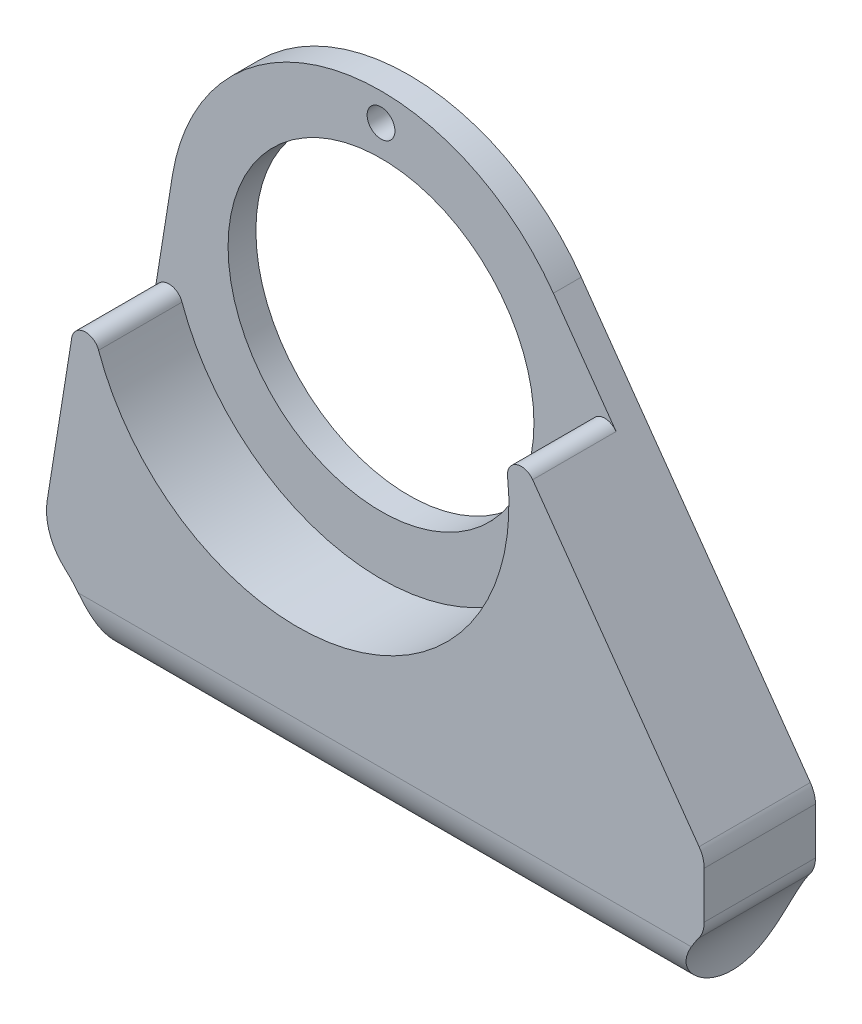
ISO-10303-21;
HEADER;
FILE_DESCRIPTION(('STEP AP214'),'2;1');
FILE_NAME('part.step','',(''),(''),'','','');
FILE_SCHEMA(('AUTOMOTIVE_DESIGN { 1 0 10303 214 1 1 1 1 }'));
ENDSEC;
DATA;
#1=APPLICATION_CONTEXT('core data for automotive mechanical design processes');
#2=APPLICATION_PROTOCOL_DEFINITION('international standard','automotive_design',2000,#1);
#3=PRODUCT_CONTEXT('',#1,'mechanical');
#4=PRODUCT('Part','Part','',(#3));
#5=PRODUCT_RELATED_PRODUCT_CATEGORY('part','',(#4));
#6=PRODUCT_DEFINITION_FORMATION('','',#4);
#7=PRODUCT_DEFINITION_CONTEXT('part definition',#1,'design');
#8=PRODUCT_DEFINITION('design','',#6,#7);
#9=PRODUCT_DEFINITION_SHAPE('','',#8);
#10=(LENGTH_UNIT() NAMED_UNIT(*) SI_UNIT(.MILLI.,.METRE.));
#11=(NAMED_UNIT(*) PLANE_ANGLE_UNIT() SI_UNIT($,.RADIAN.));
#12=(NAMED_UNIT(*) SI_UNIT($,.STERADIAN.) SOLID_ANGLE_UNIT());
#13=UNCERTAINTY_MEASURE_WITH_UNIT(LENGTH_MEASURE(1.E-05),#10,'distance_accuracy_value','');
#14=(GEOMETRIC_REPRESENTATION_CONTEXT(3) GLOBAL_UNCERTAINTY_ASSIGNED_CONTEXT((#13)) GLOBAL_UNIT_ASSIGNED_CONTEXT((#10,
#11,#12)) REPRESENTATION_CONTEXT('',''));
#15=CARTESIAN_POINT('',(0.,0.,0.));
#16=DIRECTION('',(0.,0.,1.));
#17=DIRECTION('',(1.,0.,0.));
#18=AXIS2_PLACEMENT_3D('',#15,#16,#17);
#19=CARTESIAN_POINT('',(0.,0.,5.));
#20=DIRECTION('',(0.,0.,-1.));
#21=DIRECTION('',(-1.,0.,0.));
#22=AXIS2_PLACEMENT_3D('',#19,#20,#21);
#23=CYLINDRICAL_SURFACE('',#22,38.);
#24=DIRECTION('',(0.,0.,-1.));
#25=VECTOR('',#24,1.);
#26=CARTESIAN_POINT('',(-37.5209884030344,6.01460133835652,5.));
#27=LINE('',#26,#25);
#28=CARTESIAN_POINT('',(-37.5209884030344,6.01460133835652,5.));
#29=VERTEX_POINT('',#28);
#30=CARTESIAN_POINT('',(-37.5209884030344,6.01460133835652,0.));
#31=VERTEX_POINT('',#30);
#32=EDGE_CURVE('E170',#29,#31,#27,.T.);
#33=ORIENTED_EDGE('',*,*,#32,.F.);
#34=CARTESIAN_POINT('',(0.,0.,5.));
#35=DIRECTION('',(0.,0.,1.));
#36=DIRECTION('',(1.,0.,0.));
#37=AXIS2_PLACEMENT_3D('',#34,#35,#36);
#38=CIRCLE('',#37,38.);
#39=CARTESIAN_POINT('',(30.9950052682842,21.9843045925732,5.));
#40=VERTEX_POINT('',#39);
#41=EDGE_CURVE('E167',#40,#29,#38,.T.);
#42=ORIENTED_EDGE('',*,*,#41,.F.);
#43=DIRECTION('',(0.,0.,-1.));
#44=VECTOR('',#43,1.);
#45=CARTESIAN_POINT('',(30.9950052682842,21.9843045925732,5.));
#46=LINE('',#45,#44);
#47=CARTESIAN_POINT('',(30.9950052682842,21.9843045925732,0.));
#48=VERTEX_POINT('',#47);
#49=EDGE_CURVE('E165',#40,#48,#46,.T.);
#50=ORIENTED_EDGE('',*,*,#49,.T.);
#51=CARTESIAN_POINT('',(0.,0.,0.));
#52=DIRECTION('',(0.,0.,1.));
#53=DIRECTION('',(1.,0.,0.));
#54=AXIS2_PLACEMENT_3D('',#51,#52,#53);
#55=CIRCLE('',#54,38.);
#56=EDGE_CURVE('E148',#48,#31,#55,.T.);
#57=ORIENTED_EDGE('',*,*,#56,.T.);
#58=EDGE_LOOP('',(#33,#42,#50,#57));
#59=FACE_BOUND('',#58,.T.);
#60=ADVANCED_FACE('F44',(#59),#23,.T.);
#61=CARTESIAN_POINT('',(0.,0.,5.));
#62=DIRECTION('',(0.,0.,1.));
#63=DIRECTION('',(1.,0.,0.));
#64=AXIS2_PLACEMENT_3D('',#61,#62,#63);
#65=PLANE('',#64);
#66=CARTESIAN_POINT('',(0.,33.,5.));
#67=DIRECTION('',(0.,0.,1.));
#68=DIRECTION('',(1.,0.,0.));
#69=AXIS2_PLACEMENT_3D('',#66,#67,#68);
#70=CIRCLE('',#69,2.5);
#71=CARTESIAN_POINT('',(2.5,33.,5.));
#72=VERTEX_POINT('',#71);
#73=EDGE_CURVE('E161',#72,#72,#70,.T.);
#74=ORIENTED_EDGE('',*,*,#73,.F.);
#75=EDGE_LOOP('',(#74));
#76=FACE_BOUND('',#75,.T.);
#77=ORIENTED_EDGE('',*,*,#41,.T.);
#78=DIRECTION('',(0.158278982588329,0.987394431658799,0.));
#79=VECTOR('',#78,1.);
#80=CARTESIAN_POINT('',(-46.8836146172965,-52.3924267994827,5.));
#81=LINE('',#80,#79);
#82=CARTESIAN_POINT('',(-40.6064137878225,-13.2332595868192,5.));
#83=VERTEX_POINT('',#82);
#84=EDGE_CURVE('E214',#83,#29,#81,.T.);
#85=ORIENTED_EDGE('',*,*,#84,.F.);
#86=CARTESIAN_POINT('',(-38.1379277086755,-13.62895704329,5.));
#87=DIRECTION('',(0.,0.,1.));
#88=DIRECTION('',(1.,0.,0.));
#89=AXIS2_PLACEMENT_3D('',#86,#87,#88);
#90=CIRCLE('',#89,2.5);
#91=CARTESIAN_POINT('',(-35.7837346402387,-12.7876633986425,5.));
#92=VERTEX_POINT('',#91);
#93=EDGE_CURVE('E221',#83,#92,#90,.F.);
#94=ORIENTED_EDGE('',*,*,#93,.T.);
#95=CARTESIAN_POINT('',(37.7500167500985,4.35157849145371,5.));
#96=VERTEX_POINT('',#95);
#97=EDGE_CURVE('E160',#92,#96,#38,.T.);
#98=ORIENTED_EDGE('',*,*,#97,.T.);
#99=CARTESIAN_POINT('',(40.2335704836576,4.63786655010198,5.));
#100=DIRECTION('',(0.,0.,1.));
#101=DIRECTION('',(1.,0.,0.));
#102=AXIS2_PLACEMENT_3D('',#99,#100,#101);
#103=CIRCLE('',#102,2.5);
#104=CARTESIAN_POINT('',(42.2727155670974,6.08420237856073,5.));
#105=VERTEX_POINT('',#104);
#106=EDGE_CURVE('E219',#96,#105,#103,.F.);
#107=ORIENTED_EDGE('',*,*,#106,.T.);
#108=DIRECTION('',(0.578534331383504,-0.815658033375901,0.));
#109=VECTOR('',#108,1.);
#110=CARTESIAN_POINT('',(30.9950052682842,21.9843045925732,5.));
#111=LINE('',#110,#109);
#112=EDGE_CURVE('E207',#40,#105,#111,.T.);
#113=ORIENTED_EDGE('',*,*,#112,.F.);
#114=EDGE_LOOP('',(#77,#85,#94,#98,#107,#113));
#115=FACE_BOUND('',#114,.T.);
#116=CARTESIAN_POINT('',(0.,0.,5.));
#117=DIRECTION('',(0.,0.,1.));
#118=DIRECTION('',(1.,0.,0.));
#119=AXIS2_PLACEMENT_3D('',#116,#117,#118);
#120=CIRCLE('',#119,27.5);
#121=CARTESIAN_POINT('',(27.5,0.,5.));
#122=VERTEX_POINT('',#121);
#123=EDGE_CURVE('E187',#122,#122,#120,.T.);
#124=ORIENTED_EDGE('',*,*,#123,.F.);
#125=EDGE_LOOP('',(#124));
#126=FACE_BOUND('',#125,.T.);
#127=ADVANCED_FACE('F290',(#76,#115,#126),#65,.T.);
#128=CARTESIAN_POINT('',(0.,0.,0.));
#129=DIRECTION('',(0.,0.,1.));
#130=DIRECTION('',(1.,0.,0.));
#131=AXIS2_PLACEMENT_3D('',#128,#129,#130);
#132=PLANE('',#131);
#133=DIRECTION('',(0.,-1.,0.));
#134=VECTOR('',#133,1.);
#135=CARTESIAN_POINT('',(73.1163853827035,-37.4013536190073,0.));
#136=LINE('',#135,#134);
#137=CARTESIAN_POINT('',(73.1163853827035,-38.9945344954409,0.));
#138=VERTEX_POINT('',#137);
#139=CARTESIAN_POINT('',(73.1163853827035,-47.3924267994827,0.));
#140=VERTEX_POINT('',#139);
#141=EDGE_CURVE('E177',#138,#140,#136,.T.);
#142=ORIENTED_EDGE('',*,*,#141,.T.);
#143=CARTESIAN_POINT('',(68.1163853827035,-47.3924267994827,0.));
#144=DIRECTION('',(0.,0.,1.));
#145=DIRECTION('',(1.,0.,0.));
#146=AXIS2_PLACEMENT_3D('',#143,#144,#145);
#147=CIRCLE('',#146,5.);
#148=CARTESIAN_POINT('',(72.1163853827035,-50.3924267994827,0.));
#149=VERTEX_POINT('',#148);
#150=EDGE_CURVE('E237',#140,#149,#147,.F.);
#151=ORIENTED_EDGE('',*,*,#150,.T.);
#152=CARTESIAN_POINT('',(88.1163853827035,-62.3924267994827,0.));
#153=DIRECTION('',(0.,0.,1.));
#154=DIRECTION('',(1.,0.,0.));
#155=AXIS2_PLACEMENT_3D('',#152,#153,#154);
#156=CIRCLE('',#155,20.);
#157=CARTESIAN_POINT('',(70.7958773070147,-52.3924267994827,0.));
#158=VERTEX_POINT('',#157);
#159=EDGE_CURVE('E59',#149,#158,#156,.T.);
#160=ORIENTED_EDGE('',*,*,#159,.T.);
#161=DIRECTION('',(-1.,0.,0.));
#162=VECTOR('',#161,1.);
#163=CARTESIAN_POINT('',(73.1163853827035,-52.3924267994827,0.));
#164=LINE('',#163,#162);
#165=CARTESIAN_POINT('',(-39.4299255812801,-52.3924267994827,0.));
#166=VERTEX_POINT('',#165);
#167=EDGE_CURVE('E65',#158,#166,#164,.T.);
#168=ORIENTED_EDGE('',*,*,#167,.T.);
#169=CARTESIAN_POINT('',(-55.1529531364286,-64.7531065744806,0.));
#170=DIRECTION('',(0.,0.,1.));
#171=DIRECTION('',(1.,0.,0.));
#172=AXIS2_PLACEMENT_3D('',#169,#170,#171);
#173=CIRCLE('',#172,20.);
#174=CARTESIAN_POINT('',(-41.8196198030953,-49.845986724482,0.));
#175=VERTEX_POINT('',#174);
#176=EDGE_CURVE('E257',#166,#175,#173,.T.);
#177=ORIENTED_EDGE('',*,*,#176,.T.);
#178=CARTESIAN_POINT('',(-35.1529531364286,-42.3924267994827,0.));
#179=DIRECTION('',(0.,0.,1.));
#180=DIRECTION('',(1.,0.,0.));
#181=AXIS2_PLACEMENT_3D('',#178,#179,#180);
#182=CIRCLE('',#181,10.);
#183=CARTESIAN_POINT('',(-45.0268974530166,-40.8096369735994,0.));
#184=VERTEX_POINT('',#183);
#185=EDGE_CURVE('E223',#175,#184,#182,.F.);
#186=ORIENTED_EDGE('',*,*,#185,.T.);
#187=DIRECTION('',(0.158278982588329,0.987394431658799,0.));
#188=VECTOR('',#187,1.);
#189=CARTESIAN_POINT('',(-46.8836146172965,-52.3924267994827,0.));
#190=LINE('',#189,#188);
#191=EDGE_CURVE('E156',#184,#31,#190,.T.);
#192=ORIENTED_EDGE('',*,*,#191,.T.);
#193=ORIENTED_EDGE('',*,*,#56,.F.);
#194=DIRECTION('',(0.578534331383504,-0.815658033375901,0.));
#195=VECTOR('',#194,1.);
#196=CARTESIAN_POINT('',(30.9950052682842,21.9843045925732,0.));
#197=LINE('',#196,#195);
#198=CARTESIAN_POINT('',(72.194675549583,-36.1018628385234,0.));
#199=VERTEX_POINT('',#198);
#200=EDGE_CURVE('E154',#48,#199,#197,.T.);
#201=ORIENTED_EDGE('',*,*,#200,.T.);
#202=CARTESIAN_POINT('',(68.1163853827035,-38.9945344954409,0.));
#203=DIRECTION('',(0.,0.,1.));
#204=DIRECTION('',(1.,0.,0.));
#205=AXIS2_PLACEMENT_3D('',#202,#203,#204);
#206=CIRCLE('',#205,5.);
#207=EDGE_CURVE('E235',#199,#138,#206,.F.);
#208=ORIENTED_EDGE('',*,*,#207,.T.);
#209=EDGE_LOOP('',(#142,#151,#160,#168,#177,#186,#192,#193,#201,#208));
#210=FACE_BOUND('',#209,.T.);
#211=CARTESIAN_POINT('',(0.,33.,0.));
#212=DIRECTION('',(0.,0.,1.));
#213=DIRECTION('',(1.,0.,0.));
#214=AXIS2_PLACEMENT_3D('',#211,#212,#213);
#215=CIRCLE('',#214,2.5);
#216=CARTESIAN_POINT('',(2.5,33.,0.));
#217=VERTEX_POINT('',#216);
#218=EDGE_CURVE('E190',#217,#217,#215,.T.);
#219=ORIENTED_EDGE('',*,*,#218,.T.);
#220=EDGE_LOOP('',(#219));
#221=FACE_BOUND('',#220,.T.);
#222=CARTESIAN_POINT('',(0.,0.,0.));
#223=DIRECTION('',(0.,0.,1.));
#224=DIRECTION('',(1.,0.,0.));
#225=AXIS2_PLACEMENT_3D('',#222,#223,#224);
#226=CIRCLE('',#225,27.5);
#227=CARTESIAN_POINT('',(27.5,0.,0.));
#228=VERTEX_POINT('',#227);
#229=EDGE_CURVE('E191',#228,#228,#226,.T.);
#230=ORIENTED_EDGE('',*,*,#229,.T.);
#231=EDGE_LOOP('',(#230));
#232=FACE_BOUND('',#231,.T.);
#233=ADVANCED_FACE('F151',(#210,#221,#232),#132,.F.);
#234=CARTESIAN_POINT('',(0.,33.,5.));
#235=DIRECTION('',(0.,0.,-1.));
#236=DIRECTION('',(-1.,0.,0.));
#237=AXIS2_PLACEMENT_3D('',#234,#235,#236);
#238=CYLINDRICAL_SURFACE('',#237,2.5);
#239=ORIENTED_EDGE('',*,*,#73,.T.);
#240=EDGE_LOOP('',(#239));
#241=FACE_BOUND('',#240,.T.);
#242=ORIENTED_EDGE('',*,*,#218,.F.);
#243=EDGE_LOOP('',(#242));
#244=FACE_BOUND('',#243,.T.);
#245=ADVANCED_FACE('F293',(#241,#244),#238,.F.);
#246=CARTESIAN_POINT('',(0.,0.,5.));
#247=DIRECTION('',(0.,0.,-1.));
#248=DIRECTION('',(-1.,0.,0.));
#249=AXIS2_PLACEMENT_3D('',#246,#247,#248);
#250=CYLINDRICAL_SURFACE('',#249,27.5);
#251=ORIENTED_EDGE('',*,*,#123,.T.);
#252=EDGE_LOOP('',(#251));
#253=FACE_BOUND('',#252,.T.);
#254=ORIENTED_EDGE('',*,*,#229,.F.);
#255=EDGE_LOOP('',(#254));
#256=FACE_BOUND('',#255,.T.);
#257=ADVANCED_FACE('F299',(#253,#256),#250,.F.);
#258=CARTESIAN_POINT('',(0.,0.,20.));
#259=DIRECTION('',(0.,0.,-1.));
#260=DIRECTION('',(-1.,0.,0.));
#261=AXIS2_PLACEMENT_3D('',#258,#259,#260);
#262=CYLINDRICAL_SURFACE('',#261,38.);
#263=CARTESIAN_POINT('',(0.,0.,20.));
#264=DIRECTION('',(0.,0.,1.));
#265=DIRECTION('',(-1.,0.,0.));
#266=AXIS2_PLACEMENT_3D('',#263,#264,#265);
#267=CIRCLE('',#266,38.);
#268=CARTESIAN_POINT('',(-35.7837346402387,-12.7876633986425,20.));
#269=VERTEX_POINT('',#268);
#270=CARTESIAN_POINT('',(37.7500167500985,4.35157849145371,20.));
#271=VERTEX_POINT('',#270);
#272=EDGE_CURVE('E186',#269,#271,#267,.T.);
#273=ORIENTED_EDGE('',*,*,#272,.T.);
#274=DIRECTION('',(0.,0.,-1.));
#275=VECTOR('',#274,1.);
#276=CARTESIAN_POINT('',(37.7500167500985,4.35157849145371,20.));
#277=LINE('',#276,#275);
#278=EDGE_CURVE('E202',#271,#96,#277,.T.);
#279=ORIENTED_EDGE('',*,*,#278,.T.);
#280=ORIENTED_EDGE('',*,*,#97,.F.);
#281=DIRECTION('',(0.,0.,-1.));
#282=VECTOR('',#281,1.);
#283=CARTESIAN_POINT('',(-35.7837346402387,-12.7876633986425,20.));
#284=LINE('',#283,#282);
#285=EDGE_CURVE('E200',#92,#269,#284,.F.);
#286=ORIENTED_EDGE('',*,*,#285,.T.);
#287=EDGE_LOOP('',(#273,#279,#280,#286));
#288=FACE_BOUND('',#287,.T.);
#289=ADVANCED_FACE('F303',(#288),#262,.F.);
#290=CARTESIAN_POINT('',(-46.8836146172965,-52.3924267994827,20.));
#291=DIRECTION('',(-0.987394431658799,0.158278982588329,0.));
#292=DIRECTION('',(-0.158278982588329,-0.987394431658799,0.));
#293=AXIS2_PLACEMENT_3D('',#290,#291,#292);
#294=PLANE('',#293);
#295=ORIENTED_EDGE('',*,*,#191,.F.);
#296=DIRECTION('',(0.,0.,-1.));
#297=VECTOR('',#296,1.);
#298=CARTESIAN_POINT('',(-45.0268974530166,-40.8096369735994,20.));
#299=LINE('',#298,#297);
#300=CARTESIAN_POINT('',(-45.0268974530166,-40.8096369735994,20.));
#301=VERTEX_POINT('',#300);
#302=EDGE_CURVE('E225',#184,#301,#299,.F.);
#303=ORIENTED_EDGE('',*,*,#302,.T.);
#304=DIRECTION('',(0.158278982588329,0.987394431658799,0.));
#305=VECTOR('',#304,1.);
#306=CARTESIAN_POINT('',(-46.8836146172965,-52.3924267994827,20.));
#307=LINE('',#306,#305);
#308=CARTESIAN_POINT('',(-40.6064137878225,-13.2332595868192,20.));
#309=VERTEX_POINT('',#308);
#310=EDGE_CURVE('E181',#301,#309,#307,.T.);
#311=ORIENTED_EDGE('',*,*,#310,.T.);
#312=DIRECTION('',(0.,0.,-1.));
#313=VECTOR('',#312,1.);
#314=CARTESIAN_POINT('',(-40.6064137878225,-13.2332595868192,20.));
#315=LINE('',#314,#313);
#316=EDGE_CURVE('E216',#309,#83,#315,.T.);
#317=ORIENTED_EDGE('',*,*,#316,.T.);
#318=ORIENTED_EDGE('',*,*,#84,.T.);
#319=ORIENTED_EDGE('',*,*,#32,.T.);
#320=EDGE_LOOP('',(#295,#303,#311,#317,#318,#319));
#321=FACE_BOUND('',#320,.T.);
#322=ADVANCED_FACE('F307',(#321),#294,.T.);
#323=CARTESIAN_POINT('',(73.1163853827035,-37.4013536190073,20.));
#324=DIRECTION('',(1.,0.,0.));
#325=DIRECTION('',(0.,0.,-1.));
#326=AXIS2_PLACEMENT_3D('',#323,#324,#325);
#327=PLANE('',#326);
#328=DIRECTION('',(0.,-1.,0.));
#329=VECTOR('',#328,1.);
#330=CARTESIAN_POINT('',(73.1163853827035,-37.4013536190073,20.));
#331=LINE('',#330,#329);
#332=CARTESIAN_POINT('',(73.1163853827035,-38.9945344954409,20.));
#333=VERTEX_POINT('',#332);
#334=CARTESIAN_POINT('',(73.1163853827035,-47.3924267994827,20.));
#335=VERTEX_POINT('',#334);
#336=EDGE_CURVE('E330',#333,#335,#331,.T.);
#337=ORIENTED_EDGE('',*,*,#336,.T.);
#338=DIRECTION('',(0.,0.,-1.));
#339=VECTOR('',#338,1.);
#340=CARTESIAN_POINT('',(73.1163853827035,-47.3924267994827,20.));
#341=LINE('',#340,#339);
#342=EDGE_CURVE('E232',#335,#140,#341,.T.);
#343=ORIENTED_EDGE('',*,*,#342,.T.);
#344=ORIENTED_EDGE('',*,*,#141,.F.);
#345=DIRECTION('',(0.,0.,-1.));
#346=VECTOR('',#345,1.);
#347=CARTESIAN_POINT('',(73.1163853827035,-38.9945344954409,20.));
#348=LINE('',#347,#346);
#349=EDGE_CURVE('E230',#138,#333,#348,.F.);
#350=ORIENTED_EDGE('',*,*,#349,.T.);
#351=EDGE_LOOP('',(#337,#343,#344,#350));
#352=FACE_BOUND('',#351,.T.);
#353=ADVANCED_FACE('F311',(#352),#327,.T.);
#354=CARTESIAN_POINT('',(30.9950052682842,21.9843045925732,20.));
#355=DIRECTION('',(0.815658033375901,0.578534331383504,0.));
#356=DIRECTION('',(-0.578534331383504,0.815658033375901,0.));
#357=AXIS2_PLACEMENT_3D('',#354,#355,#356);
#358=PLANE('',#357);
#359=DIRECTION('',(0.578534331383504,-0.815658033375901,0.));
#360=VECTOR('',#359,1.);
#361=CARTESIAN_POINT('',(30.9950052682842,21.9843045925732,20.));
#362=LINE('',#361,#360);
#363=CARTESIAN_POINT('',(42.2727155670974,6.08420237856072,20.));
#364=VERTEX_POINT('',#363);
#365=CARTESIAN_POINT('',(72.194675549583,-36.1018628385234,20.));
#366=VERTEX_POINT('',#365);
#367=EDGE_CURVE('E361',#364,#366,#362,.T.);
#368=ORIENTED_EDGE('',*,*,#367,.T.);
#369=DIRECTION('',(0.,0.,-1.));
#370=VECTOR('',#369,1.);
#371=CARTESIAN_POINT('',(72.194675549583,-36.1018628385233,20.));
#372=LINE('',#371,#370);
#373=EDGE_CURVE('E176',#366,#199,#372,.T.);
#374=ORIENTED_EDGE('',*,*,#373,.T.);
#375=ORIENTED_EDGE('',*,*,#200,.F.);
#376=ORIENTED_EDGE('',*,*,#49,.F.);
#377=ORIENTED_EDGE('',*,*,#112,.T.);
#378=DIRECTION('',(0.,0.,-1.));
#379=VECTOR('',#378,1.);
#380=CARTESIAN_POINT('',(42.2727155670974,6.08420237856073,20.));
#381=LINE('',#380,#379);
#382=EDGE_CURVE('E205',#105,#364,#381,.F.);
#383=ORIENTED_EDGE('',*,*,#382,.T.);
#384=EDGE_LOOP('',(#368,#374,#375,#376,#377,#383));
#385=FACE_BOUND('',#384,.T.);
#386=ADVANCED_FACE('F174',(#385),#358,.T.);
#387=CARTESIAN_POINT('',(0.,0.,20.));
#388=DIRECTION('',(0.,0.,-1.));
#389=DIRECTION('',(-1.,0.,0.));
#390=AXIS2_PLACEMENT_3D('',#387,#388,#389);
#391=PLANE('',#390);
#392=DIRECTION('',(-1.,0.,0.));
#393=VECTOR('',#392,1.);
#394=CARTESIAN_POINT('',(73.1163853827035,-52.3924267994827,20.));
#395=LINE('',#394,#393);
#396=CARTESIAN_POINT('',(70.7958773070147,-52.3924267994827,20.));
#397=VERTEX_POINT('',#396);
#398=CARTESIAN_POINT('',(-39.4299255812802,-52.3924267994827,20.));
#399=VERTEX_POINT('',#398);
#400=EDGE_CURVE('E323',#397,#399,#395,.T.);
#401=ORIENTED_EDGE('',*,*,#400,.F.);
#402=CARTESIAN_POINT('',(88.1163853827035,-62.3924267994827,20.));
#403=DIRECTION('',(0.,0.,-1.));
#404=DIRECTION('',(-1.,0.,0.));
#405=AXIS2_PLACEMENT_3D('',#402,#403,#404);
#406=CIRCLE('',#405,20.);
#407=CARTESIAN_POINT('',(72.1163853827035,-50.3924267994827,20.));
#408=VERTEX_POINT('',#407);
#409=EDGE_CURVE('E326',#397,#408,#406,.T.);
#410=ORIENTED_EDGE('',*,*,#409,.T.);
#411=CARTESIAN_POINT('',(68.1163853827035,-47.3924267994827,20.));
#412=DIRECTION('',(0.,0.,-1.));
#413=DIRECTION('',(-1.,0.,0.));
#414=AXIS2_PLACEMENT_3D('',#411,#412,#413);
#415=CIRCLE('',#414,5.);
#416=EDGE_CURVE('E242',#408,#335,#415,.F.);
#417=ORIENTED_EDGE('',*,*,#416,.T.);
#418=ORIENTED_EDGE('',*,*,#336,.F.);
#419=CARTESIAN_POINT('',(68.1163853827035,-38.9945344954409,20.));
#420=DIRECTION('',(0.,0.,-1.));
#421=DIRECTION('',(-1.,0.,0.));
#422=AXIS2_PLACEMENT_3D('',#419,#420,#421);
#423=CIRCLE('',#422,5.);
#424=EDGE_CURVE('E240',#333,#366,#423,.F.);
#425=ORIENTED_EDGE('',*,*,#424,.T.);
#426=ORIENTED_EDGE('',*,*,#367,.F.);
#427=CARTESIAN_POINT('',(40.2335704836576,4.63786655010198,20.));
#428=DIRECTION('',(0.,0.,-1.));
#429=DIRECTION('',(-1.,0.,0.));
#430=AXIS2_PLACEMENT_3D('',#427,#428,#429);
#431=CIRCLE('',#430,2.5);
#432=EDGE_CURVE('E212',#364,#271,#431,.F.);
#433=ORIENTED_EDGE('',*,*,#432,.T.);
#434=ORIENTED_EDGE('',*,*,#272,.F.);
#435=CARTESIAN_POINT('',(-38.1379277086755,-13.62895704329,20.));
#436=DIRECTION('',(0.,0.,-1.));
#437=DIRECTION('',(-1.,0.,0.));
#438=AXIS2_PLACEMENT_3D('',#435,#436,#437);
#439=CIRCLE('',#438,2.5);
#440=EDGE_CURVE('E209',#269,#309,#439,.F.);
#441=ORIENTED_EDGE('',*,*,#440,.T.);
#442=ORIENTED_EDGE('',*,*,#310,.F.);
#443=CARTESIAN_POINT('',(-35.1529531364286,-42.3924267994827,20.));
#444=DIRECTION('',(0.,0.,-1.));
#445=DIRECTION('',(-1.,0.,0.));
#446=AXIS2_PLACEMENT_3D('',#443,#444,#445);
#447=CIRCLE('',#446,10.);
#448=CARTESIAN_POINT('',(-41.8196198030953,-49.845986724482,20.));
#449=VERTEX_POINT('',#448);
#450=EDGE_CURVE('E227',#301,#449,#447,.F.);
#451=ORIENTED_EDGE('',*,*,#450,.T.);
#452=CARTESIAN_POINT('',(-55.1529531364286,-64.7531065744806,20.));
#453=DIRECTION('',(0.,0.,-1.));
#454=DIRECTION('',(-1.,0.,0.));
#455=AXIS2_PLACEMENT_3D('',#452,#453,#454);
#456=CIRCLE('',#455,20.);
#457=EDGE_CURVE('E328',#449,#399,#456,.T.);
#458=ORIENTED_EDGE('',*,*,#457,.T.);
#459=EDGE_LOOP('',(#401,#410,#417,#418,#425,#426,#433,#434,#441,#442,#451,#458));
#460=FACE_BOUND('',#459,.T.);
#461=ADVANCED_FACE('F286',(#460),#391,.F.);
#462=CARTESIAN_POINT('',(40.2335704836576,4.63786655010198,20.));
#463=DIRECTION('',(0.,0.,-1.));
#464=DIRECTION('',(-1.,0.,0.));
#465=AXIS2_PLACEMENT_3D('',#462,#463,#464);
#466=CYLINDRICAL_SURFACE('',#465,2.5);
#467=ORIENTED_EDGE('',*,*,#432,.F.);
#468=ORIENTED_EDGE('',*,*,#382,.F.);
#469=ORIENTED_EDGE('',*,*,#106,.F.);
#470=ORIENTED_EDGE('',*,*,#278,.F.);
#471=EDGE_LOOP('',(#467,#468,#469,#470));
#472=FACE_BOUND('',#471,.T.);
#473=ADVANCED_FACE('F282',(#472),#466,.T.);
#474=CARTESIAN_POINT('',(-38.1379277086755,-13.62895704329,20.));
#475=DIRECTION('',(0.,0.,-1.));
#476=DIRECTION('',(-1.,0.,0.));
#477=AXIS2_PLACEMENT_3D('',#474,#475,#476);
#478=CYLINDRICAL_SURFACE('',#477,2.5);
#479=ORIENTED_EDGE('',*,*,#440,.F.);
#480=ORIENTED_EDGE('',*,*,#285,.F.);
#481=ORIENTED_EDGE('',*,*,#93,.F.);
#482=ORIENTED_EDGE('',*,*,#316,.F.);
#483=EDGE_LOOP('',(#479,#480,#481,#482));
#484=FACE_BOUND('',#483,.T.);
#485=ADVANCED_FACE('F278',(#484),#478,.T.);
#486=CARTESIAN_POINT('',(-35.1529531364286,-42.3924267994827,20.));
#487=DIRECTION('',(0.,0.,-1.));
#488=DIRECTION('',(-1.,0.,0.));
#489=AXIS2_PLACEMENT_3D('',#486,#487,#488);
#490=CYLINDRICAL_SURFACE('',#489,10.);
#491=ORIENTED_EDGE('',*,*,#185,.F.);
#492=DIRECTION('',(0.,0.,-1.));
#493=VECTOR('',#492,1.);
#494=CARTESIAN_POINT('',(-41.8196198030953,-49.845986724482,20.));
#495=LINE('',#494,#493);
#496=EDGE_CURVE('E245',#175,#449,#495,.F.);
#497=ORIENTED_EDGE('',*,*,#496,.T.);
#498=ORIENTED_EDGE('',*,*,#450,.F.);
#499=ORIENTED_EDGE('',*,*,#302,.F.);
#500=EDGE_LOOP('',(#491,#497,#498,#499));
#501=FACE_BOUND('',#500,.T.);
#502=ADVANCED_FACE('F274',(#501),#490,.T.);
#503=CARTESIAN_POINT('',(68.1163853827035,-47.3924267994827,20.));
#504=DIRECTION('',(0.,0.,-1.));
#505=DIRECTION('',(-1.,0.,0.));
#506=AXIS2_PLACEMENT_3D('',#503,#504,#505);
#507=CYLINDRICAL_SURFACE('',#506,5.);
#508=ORIENTED_EDGE('',*,*,#416,.F.);
#509=DIRECTION('',(0.,0.,-1.));
#510=VECTOR('',#509,1.);
#511=CARTESIAN_POINT('',(72.1163853827035,-50.3924267994827,20.));
#512=LINE('',#511,#510);
#513=EDGE_CURVE('E248',#408,#149,#512,.T.);
#514=ORIENTED_EDGE('',*,*,#513,.T.);
#515=ORIENTED_EDGE('',*,*,#150,.F.);
#516=ORIENTED_EDGE('',*,*,#342,.F.);
#517=EDGE_LOOP('',(#508,#514,#515,#516));
#518=FACE_BOUND('',#517,.T.);
#519=ADVANCED_FACE('F270',(#518),#507,.T.);
#520=CARTESIAN_POINT('',(68.1163853827035,-38.9945344954409,20.));
#521=DIRECTION('',(0.,0.,-1.));
#522=DIRECTION('',(-1.,0.,0.));
#523=AXIS2_PLACEMENT_3D('',#520,#521,#522);
#524=CYLINDRICAL_SURFACE('',#523,5.);
#525=ORIENTED_EDGE('',*,*,#424,.F.);
#526=ORIENTED_EDGE('',*,*,#349,.F.);
#527=ORIENTED_EDGE('',*,*,#207,.F.);
#528=ORIENTED_EDGE('',*,*,#373,.F.);
#529=EDGE_LOOP('',(#525,#526,#527,#528));
#530=FACE_BOUND('',#529,.T.);
#531=ADVANCED_FACE('F267',(#530),#524,.T.);
#532=CARTESIAN_POINT('',(-35.1529531364286,-52.3924267994827,10.));
#533=DIRECTION('',(-1.,0.,0.));
#534=DIRECTION('',(0.,0.,1.));
#535=AXIS2_PLACEMENT_3D('',#532,#533,#534);
#536=CYLINDRICAL_SURFACE('',#535,10.);
#537=ORIENTED_EDGE('',*,*,#167,.F.);
#538=CARTESIAN_POINT('',(70.7958773070147,-52.3924267994827,0.));
#539=CARTESIAN_POINT('',(70.6567729671095,-52.6332735440032,-2.89828940717956E-05));
#540=CARTESIAN_POINT('',(70.5227294523134,-52.8771334633446,0.0087017338026928));
#541=CARTESIAN_POINT('',(70.2653532106928,-53.3692713124411,0.0447730549399425));
#542=CARTESIAN_POINT('',(70.1420271340983,-53.6175518717323,0.0721251223593889));
#543=CARTESIAN_POINT('',(69.906688715876,-54.116959492667,0.146582724708033));
#544=CARTESIAN_POINT('',(69.7946919233109,-54.3680899540763,0.193714962732602));
#545=CARTESIAN_POINT('',(69.5826994121422,-54.8706706599935,0.308523311292847));
#546=CARTESIAN_POINT('',(69.4827010492795,-55.1221208216543,0.376194883646425));
#547=CARTESIAN_POINT('',(69.2945446116514,-55.6240846793727,0.532909783371553));
#548=CARTESIAN_POINT('',(69.2064370269908,-55.8745902464332,0.622040031284394));
#549=CARTESIAN_POINT('',(69.042527249331,-56.3711068975987,0.821672258191989));
#550=CARTESIAN_POINT('',(68.9667260252104,-56.6171176264738,0.932175918413917));
#551=CARTESIAN_POINT('',(68.8272307965649,-57.1016805453448,1.17412031353332));
#552=CARTESIAN_POINT('',(68.7635185000335,-57.3402435401849,1.3055288538357));
#553=CARTESIAN_POINT('',(68.6474578261251,-57.8077912621146,1.58878567763748));
#554=CARTESIAN_POINT('',(68.5951087530572,-58.0367765748855,1.74063270890788));
#555=CARTESIAN_POINT('',(68.5036941727683,-58.4696267002914,2.05425894690047));
#556=CARTESIAN_POINT('',(68.4640262284223,-58.6741762707043,2.21491990973582));
#557=CARTESIAN_POINT('',(68.3930916898648,-59.0709356523271,2.55249317359919));
#558=CARTESIAN_POINT('',(68.3618247961869,-59.2631459032019,2.72940489504634));
#559=CARTESIAN_POINT('',(68.3066703858197,-59.6337456026026,3.09842568215625));
#560=CARTESIAN_POINT('',(68.282787323467,-59.8121266601723,3.29054383376016));
#561=CARTESIAN_POINT('',(68.2413510535169,-60.1535450742967,3.6885974872983));
#562=CARTESIAN_POINT('',(68.2237979912429,-60.316582078521,3.89453330632817));
#563=CARTESIAN_POINT('',(68.1936833975387,-60.6286441059799,4.3223271928861));
#564=CARTESIAN_POINT('',(68.1812085207898,-60.7773952301521,4.54439111614299));
#565=CARTESIAN_POINT('',(68.1605464349771,-61.0567198719553,4.99986012072974));
#566=CARTESIAN_POINT('',(68.152359309685,-61.1872930343994,5.23326542354352));
#567=CARTESIAN_POINT('',(68.1392187112676,-61.4293534365186,5.70984973829417));
#568=CARTESIAN_POINT('',(68.1342651868799,-61.5408409787381,5.95302859522556));
#569=CARTESIAN_POINT('',(68.1266414410995,-61.7439868230375,6.4475665270648));
#570=CARTESIAN_POINT('',(68.1239712174392,-61.8356451448099,6.69892559384855));
#571=CARTESIAN_POINT('',(68.1201664805958,-61.99567129547,7.19924344626618));
#572=CARTESIAN_POINT('',(68.1189813606287,-62.0647436102793,7.44797688302717));
#573=CARTESIAN_POINT('',(68.1173895710004,-62.1834533491449,7.95003819384821));
#574=CARTESIAN_POINT('',(68.1169828860774,-62.2330911542167,8.20336597773374));
#575=CARTESIAN_POINT('',(68.116502669988,-62.3126332647888,8.71313204766373));
#576=CARTESIAN_POINT('',(68.1164291796743,-62.3425351500989,8.96957071126613));
#577=CARTESIAN_POINT('',(68.1163863983612,-62.3824431340406,9.48400517084442));
#578=CARTESIAN_POINT('',(68.1164171130407,-62.3924481483128,9.74200105091851));
#579=CARTESIAN_POINT('',(68.1163853827035,-62.3924267994827,10.));
#580=B_SPLINE_CURVE_WITH_KNOTS('',3,(#538,#539,#540,#541,#542,#543,#544,#545,#546,#547,#548,
#549,#550,#551,#552,#553,#554,#555,#556,#557,#558,#559,#560,#561,#562,#563,#564,#565,#566,#567,
#568,#569,#570,#571,#572,#573,#574,#575,#576,#577,#578,#579),.UNSPECIFIED.,.F.,.F.,(4,2,2,2,2,2,
2,2,2,2,2,2,2,2,2,2,2,2,2,2,4),(0.,0.83431235028099,1.6691387536459,2.50509581083415,
3.340868296947,4.18008487221364,5.01936748690844,5.85736985767486,6.69532090891779,
7.48372262446205,8.2720962326863,9.06094450777075,9.84981089198666,10.6516249580703,
11.4534546889452,12.2552717080681,13.0570879308976,13.8307645145585,14.6044259294532,
15.378182199828,16.1519806379826),.UNSPECIFIED.);
#581=CARTESIAN_POINT('',(68.1163853827035,-62.3924267994827,10.));
#582=VERTEX_POINT('',#581);
#583=EDGE_CURVE('E11',#158,#582,#580,.T.);
#584=ORIENTED_EDGE('',*,*,#583,.T.);
#585=CARTESIAN_POINT('',(68.1163853827035,-62.3924267994827,10.));
#586=CARTESIAN_POINT('',(68.1164296456082,-62.3924567433406,10.2805626373853));
#587=CARTESIAN_POINT('',(68.1163867748859,-62.3806207422097,10.5611210251892));
#588=CARTESIAN_POINT('',(68.1164466489412,-62.3334328975444,11.1202432263666));
#589=CARTESIAN_POINT('',(68.1165493882604,-62.2980819355425,11.3988071141145));
#590=CARTESIAN_POINT('',(68.1172202187478,-62.2040944439152,11.9518916713769));
#591=CARTESIAN_POINT('',(68.1177881687466,-62.1454649809914,12.2264135417299));
#592=CARTESIAN_POINT('',(68.120008030428,-62.0053464507267,12.7695525530659));
#593=CARTESIAN_POINT('',(68.1216599286499,-61.923857667265,13.0381697673315));
#594=CARTESIAN_POINT('',(68.1268627796016,-61.738540014221,13.5677616164803));
#595=CARTESIAN_POINT('',(68.13041495261,-61.6346968151836,13.8287312266746));
#596=CARTESIAN_POINT('',(68.1404235993077,-61.4054580178122,14.3409674737002));
#597=CARTESIAN_POINT('',(68.1468800277143,-61.2800627555333,14.5922342617499));
#598=CARTESIAN_POINT('',(68.1638494110261,-61.0086705910081,15.0832085593254));
#599=CARTESIAN_POINT('',(68.174361897155,-60.8626760707444,15.3229174010533));
#600=CARTESIAN_POINT('',(68.2007046460043,-60.5512111779104,15.7890239179821));
#601=CARTESIAN_POINT('',(68.2165348149018,-60.385741148991,16.0154218279526));
#602=CARTESIAN_POINT('',(68.2546368509732,-60.0384656485453,16.4509585511862));
#603=CARTESIAN_POINT('',(68.2768412149587,-59.8568444537787,16.6602501346368));
#604=CARTESIAN_POINT('',(68.3290342045378,-59.4773976890035,17.0625518023257));
#605=CARTESIAN_POINT('',(68.359022800426,-59.2795721808341,17.2555619486918));
#606=CARTESIAN_POINT('',(68.4279807432352,-58.8696617537826,17.6237303156232));
#607=CARTESIAN_POINT('',(68.4669435550318,-58.6575872903618,17.7989013935786));
#608=CARTESIAN_POINT('',(68.5549561185561,-58.2210922511552,18.1302973958213));
#609=CARTESIAN_POINT('',(68.6040053912084,-57.996672262114,18.286523219389));
#610=CARTESIAN_POINT('',(68.710856280551,-57.5471616072538,18.5730280044983));
#611=CARTESIAN_POINT('',(68.7682161406666,-57.3224763741659,18.7041086431448));
#612=CARTESIAN_POINT('',(68.893636680665,-56.8659491024185,18.947317246645));
#613=CARTESIAN_POINT('',(68.9616972850766,-56.6341071142444,19.0594453451578));
#614=CARTESIAN_POINT('',(69.1089526002685,-56.1652331458957,19.2645281224053));
#615=CARTESIAN_POINT('',(69.1881586649989,-55.9281960839853,19.3574630076423));
#616=CARTESIAN_POINT('',(69.3577634093912,-55.4513811007005,19.5239993517451));
#617=CARTESIAN_POINT('',(69.4481611459118,-55.2116034118271,19.597602438105));
#618=CARTESIAN_POINT('',(69.6311137447698,-54.7537253518039,19.7198302561806));
#619=CARTESIAN_POINT('',(69.7226889505191,-54.5356794397585,19.7701397092871));
#620=CARTESIAN_POINT('',(69.9147189054997,-54.1005081606777,19.8555380220128));
#621=CARTESIAN_POINT('',(70.0151742027285,-53.8833828513212,19.8906259415087));
#622=CARTESIAN_POINT('',(70.2243884259729,-53.4518584732784,19.9460956297941));
#623=CARTESIAN_POINT('',(70.3331295156682,-53.2374546462284,19.9665080528281));
#624=CARTESIAN_POINT('',(70.5586106304243,-52.8120965908759,19.9934653907493));
#625=CARTESIAN_POINT('',(70.6753478341091,-52.601141178035,20.0000151712221));
#626=CARTESIAN_POINT('',(70.7958773070147,-52.3924267994827,20.));
#627=B_SPLINE_CURVE_WITH_KNOTS('',3,(#585,#586,#587,#588,#589,#590,#591,#592,#593,#594,#595,
#596,#597,#598,#599,#600,#601,#602,#603,#604,#605,#606,#607,#608,#609,#610,#611,#612,#613,#614,
#615,#616,#617,#618,#619,#620,#621,#622,#623,#624,#625,#626),.UNSPECIFIED.,.F.,.F.,(4,2,2,2,2,2,
2,2,2,2,2,2,2,2,2,2,2,2,2,2,4),(0.,0.841432372616265,1.68283320326807,2.5239788032209,
3.36511395784561,4.20678990454419,5.04845272842231,5.89001830677085,6.73156903767483,
7.56451718005767,8.39746214387061,9.22980245490532,10.0621032415009,10.8602498176647,
11.6583907648246,12.4573507499772,13.2562434511754,13.9809573838289,14.7057160704186,
15.4289564442854,16.1519429291931),.UNSPECIFIED.);
#628=EDGE_CURVE('E332',#582,#397,#627,.T.);
#629=ORIENTED_EDGE('',*,*,#628,.T.);
#630=ORIENTED_EDGE('',*,*,#400,.T.);
#631=CARTESIAN_POINT('',(-39.4299255812802,-52.3924267994827,20.));
#632=CARTESIAN_POINT('',(-39.3366220687245,-52.5111090935359,19.999999330762));
#633=CARTESIAN_POINT('',(-39.24467044055,-52.6308414926383,19.9978867756354));
#634=CARTESIAN_POINT('',(-39.0635651683623,-52.8722661888648,19.9892118401067));
#635=CARTESIAN_POINT('',(-38.9744118554305,-52.9939587153422,19.9826489352244));
#636=CARTESIAN_POINT('',(-38.7112010580915,-53.3618944527533,19.9559338374954));
#637=CARTESIAN_POINT('',(-38.5415230671002,-53.6108299610111,19.9287546283468));
#638=CARTESIAN_POINT('',(-38.2141961091669,-54.1150033123771,19.8538296248108));
#639=CARTESIAN_POINT('',(-38.0566011857026,-54.3702633990138,19.8059971317999));
#640=CARTESIAN_POINT('',(-37.7551381261347,-54.8837289905072,19.6882789131739));
#641=CARTESIAN_POINT('',(-37.6112658299277,-55.1419335759745,19.6183998989558));
#642=CARTESIAN_POINT('',(-37.337041982633,-55.6602630431236,19.4549214072005));
#643=CARTESIAN_POINT('',(-37.206779830574,-55.9203899019105,19.3611774892748));
#644=CARTESIAN_POINT('',(-36.9612170584597,-56.4378931862962,19.1494455626398));
#645=CARTESIAN_POINT('',(-36.8459179623069,-56.6952693293047,19.0314550877127));
#646=CARTESIAN_POINT('',(-36.6306784301974,-57.2031914428053,18.7714144832709));
#647=CARTESIAN_POINT('',(-36.5306954580004,-57.4537546794312,18.6294333785582));
#648=CARTESIAN_POINT('',(-36.3453921120126,-57.9454151265018,18.3215633905807));
#649=CARTESIAN_POINT('',(-36.2600698617295,-58.186513545339,18.1556775719935));
#650=CARTESIAN_POINT('',(-36.1119931287387,-58.6301660327219,17.820435877087));
#651=CARTESIAN_POINT('',(-36.047788994485,-58.8340442238142,17.6534646886783));
#652=CARTESIAN_POINT('',(-35.9297092648523,-59.2295669854497,17.302289933838));
#653=CARTESIAN_POINT('',(-35.8758329348111,-59.4212124255151,17.118087594522));
#654=CARTESIAN_POINT('',(-35.7774794187983,-59.7904884227159,16.7334855491487));
#655=CARTESIAN_POINT('',(-35.7330108380044,-59.9681060565027,16.5330712437638));
#656=CARTESIAN_POINT('',(-35.6525377802396,-60.3074104750995,16.1175952172354));
#657=CARTESIAN_POINT('',(-35.6165333742724,-60.4690971262621,15.9025333732371));
#658=CARTESIAN_POINT('',(-35.5526016134226,-60.7719394942125,15.4638235635278));
#659=CARTESIAN_POINT('',(-35.5245249144532,-60.9134458175753,15.2404390893383));
#660=CARTESIAN_POINT('',(-35.4745153004868,-61.1785727884145,14.7826362580631));
#661=CARTESIAN_POINT('',(-35.4525825499257,-61.3021929571453,14.5482176058562));
#662=CARTESIAN_POINT('',(-35.4139496661938,-61.5305073230335,14.0700902435148));
#663=CARTESIAN_POINT('',(-35.3972466519187,-61.6352119274321,13.8263867317886));
#664=CARTESIAN_POINT('',(-35.3682272372887,-61.8249937029222,13.3312124819461));
#665=CARTESIAN_POINT('',(-35.3559105902715,-61.910071977583,13.0797421814507));
#666=CARTESIAN_POINT('',(-35.3360170379392,-62.0524279388327,12.5964005008844));
#667=CARTESIAN_POINT('',(-35.3280872687199,-62.111644621117,12.3651120016741));
#668=CARTESIAN_POINT('',(-35.3147954543811,-62.2133946360928,11.8988233216591));
#669=CARTESIAN_POINT('',(-35.3094333460893,-62.2559283792309,11.6638232323177));
#670=CARTESIAN_POINT('',(-35.3009747579725,-62.3240869305703,11.1912727111729));
#671=CARTESIAN_POINT('',(-35.2978789445011,-62.349706765396,10.9537215500989));
#672=CARTESIAN_POINT('',(-35.2937731257563,-62.3838747053766,10.4774514992262));
#673=CARTESIAN_POINT('',(-35.2927625345312,-62.3924276063522,10.2387329563691));
#674=CARTESIAN_POINT('',(-35.2927614323456,-62.3924258624867,9.72276576464788));
#675=CARTESIAN_POINT('',(-35.2941229912089,-62.3808897719434,9.44551209186838));
#676=CARTESIAN_POINT('',(-35.2996802521267,-62.3348251802097,8.89293269610677));
#677=CARTESIAN_POINT('',(-35.3038762294533,-62.3002944458376,8.61760716300533));
#678=CARTESIAN_POINT('',(-35.3154382550796,-62.2084761345348,8.07073178578457));
#679=CARTESIAN_POINT('',(-35.3228055184301,-62.151179835823,7.7991834300664));
#680=CARTESIAN_POINT('',(-35.3412521656007,-62.0142617900652,7.26190902567436));
#681=CARTESIAN_POINT('',(-35.3523314579926,-61.9346405928944,6.99618283377104));
#682=CARTESIAN_POINT('',(-35.3789403116224,-61.7536430334011,6.47232934056427));
#683=CARTESIAN_POINT('',(-35.3944719889064,-61.6522563325446,6.21420571694398));
#684=CARTESIAN_POINT('',(-35.4308782865302,-61.4285620319465,5.7075721210572));
#685=CARTESIAN_POINT('',(-35.451752948939,-61.3062542674811,5.45906222450413));
#686=CARTESIAN_POINT('',(-35.499864672064,-61.0417492794358,4.97350531397001));
#687=CARTESIAN_POINT('',(-35.5271016509476,-60.8995523116812,4.73645815260205));
#688=CARTESIAN_POINT('',(-35.5890370346288,-60.5965349669535,4.27560897065876));
#689=CARTESIAN_POINT('',(-35.6237352929582,-60.4357149555874,4.05180669019067));
#690=CARTESIAN_POINT('',(-35.7011452070237,-60.0994538527645,3.62230238864861));
#691=CARTESIAN_POINT('',(-35.7437320986142,-59.9242613062654,3.41638333297936));
#692=CARTESIAN_POINT('',(-35.8382795944468,-59.5589788019134,3.020525794144));
#693=CARTESIAN_POINT('',(-35.8902400902045,-59.3688890164864,2.83058712606804));
#694=CARTESIAN_POINT('',(-36.0044200820581,-58.9759544555626,2.46816548777445));
#695=CARTESIAN_POINT('',(-36.066629628696,-58.7731221670862,2.29566584781051));
#696=CARTESIAN_POINT('',(-36.2021224342907,-58.3567062262291,1.9689727859117));
#697=CARTESIAN_POINT('',(-36.2754053607824,-58.1431228967639,1.81477881461894));
#698=CARTESIAN_POINT('',(-36.4311253860051,-57.7143901896846,1.53000341620893));
#699=CARTESIAN_POINT('',(-36.513202059612,-57.4995013659541,1.39883184568163));
#700=CARTESIAN_POINT('',(-36.6885801980579,-57.06402189573,1.15474675541451));
#701=CARTESIAN_POINT('',(-36.7818815311617,-56.8434313161774,1.04183302143312));
#702=CARTESIAN_POINT('',(-36.9799753794039,-56.3983280641732,0.834129215583045));
#703=CARTESIAN_POINT('',(-37.0847891845043,-56.1738087933166,0.739373642427734));
#704=CARTESIAN_POINT('',(-37.3056219132202,-55.7233951181868,0.567994840542597));
#705=CARTESIAN_POINT('',(-37.4216406497058,-55.4975007369377,0.491371309069431));
#706=CARTESIAN_POINT('',(-37.6762977301332,-55.0245189216058,0.34915475246827));
#707=CARTESIAN_POINT('',(-37.8160384741735,-54.7774902854037,0.285340103366601));
#708=CARTESIAN_POINT('',(-38.1080248933137,-54.2863923096206,0.177773990856303));
#709=CARTESIAN_POINT('',(-38.2602749850421,-54.0423240504557,0.134029649798268));
#710=CARTESIAN_POINT('',(-38.5759938023086,-53.559931285277,0.0654085401826111));
#711=CARTESIAN_POINT('',(-38.7394280674642,-53.3215919448294,0.0404764308406096));
#712=CARTESIAN_POINT('',(-39.0769076558199,-52.851644437408,0.00777193775637778));
#713=CARTESIAN_POINT('',(-39.2509432577528,-52.6200303829376,-1.59306423918359E-05));
#714=CARTESIAN_POINT('',(-39.4299255812802,-52.3924267994827,0.));
#715=B_SPLINE_CURVE_WITH_KNOTS('',3,(#631,#632,#633,#634,#635,#636,#637,#638,#639,#640,#641,
#642,#643,#644,#645,#646,#647,#648,#649,#650,#651,#652,#653,#654,#655,#656,#657,#658,#659,#660,
#661,#662,#663,#664,#665,#666,#667,#668,#669,#670,#671,#672,#673,#674,#675,#676,#677,#678,#679,
#680,#681,#682,#683,#684,#685,#686,#687,#688,#689,#690,#691,#692,#693,#694,#695,#696,#697,#698,
#699,#700,#701,#702,#703,#704,#705,#706,#707,#708,#709,#710,#711,#712,#713,#714),.UNSPECIFIED.,
.F.,.F.,(4,2,2,2,2,2,2,2,2,2,2,2,2,2,2,2,2,2,2,2,2,2,2,2,2,2,2,2,2,2,2,2,2,2,2,2,2,2,2,2,2,4),
(0.,0.45285286404265,0.905759106730109,1.81220282585273,2.72248919414524,3.63249872022485,
4.54815268117253,5.46389982322623,6.37705573395974,7.29009467851965,8.10279617676342,
8.91543984249555,9.72882364215702,10.5422142648322,11.3390663708785,12.1359398017401,
12.9323734529397,13.7287623105397,14.4447893815855,15.1607988352723,15.8770187311405,
16.5930373403471,17.4245307153729,18.2561048547092,19.0879978884756,19.9198704340379,
20.7521389937399,21.5844141066831,22.416678515454,23.2489265880069,24.068989521644,
24.8890429649872,25.7083049668534,26.5275423762351,27.3210122643684,28.1144728410712,
28.9094262849189,29.7043664548151,30.5760305025076,31.4480036388391,32.3174015431783,
33.1860138857131),.UNSPECIFIED.);
#716=EDGE_CURVE('E251',#399,#166,#715,.T.);
#717=ORIENTED_EDGE('',*,*,#716,.T.);
#718=EDGE_LOOP('',(#537,#584,#629,#630,#717));
#719=FACE_BOUND('',#718,.T.);
#720=ADVANCED_FACE('F259',(#719),#536,.T.);
#721=CARTESIAN_POINT('',(-55.1529531364286,-64.7531065744806,20.));
#722=DIRECTION('',(0.,0.,-1.));
#723=DIRECTION('',(-1.,0.,0.));
#724=AXIS2_PLACEMENT_3D('',#721,#722,#723);
#725=CYLINDRICAL_SURFACE('',#724,20.);
#726=ORIENTED_EDGE('',*,*,#457,.F.);
#727=ORIENTED_EDGE('',*,*,#496,.F.);
#728=ORIENTED_EDGE('',*,*,#176,.F.);
#729=ORIENTED_EDGE('',*,*,#716,.F.);
#730=EDGE_LOOP('',(#726,#727,#728,#729));
#731=FACE_BOUND('',#730,.T.);
#732=ADVANCED_FACE('F262',(#731),#725,.F.);
#733=CARTESIAN_POINT('',(88.1163853827035,-62.3924267994827,20.));
#734=DIRECTION('',(0.,0.,-1.));
#735=DIRECTION('',(-1.,0.,0.));
#736=AXIS2_PLACEMENT_3D('',#733,#734,#735);
#737=CYLINDRICAL_SURFACE('',#736,20.);
#738=ORIENTED_EDGE('',*,*,#159,.F.);
#739=ORIENTED_EDGE('',*,*,#513,.F.);
#740=ORIENTED_EDGE('',*,*,#409,.F.);
#741=ORIENTED_EDGE('',*,*,#628,.F.);
#742=ORIENTED_EDGE('',*,*,#583,.F.);
#743=EDGE_LOOP('',(#738,#739,#740,#741,#742));
#744=FACE_BOUND('',#743,.T.);
#745=ADVANCED_FACE('F46',(#744),#737,.F.);
#746=CLOSED_SHELL('',(#60,#127,#233,#245,#257,#289,#322,#353,#386,#461,#473,#485,#502,#519,#531,
#720,#732,#745));
#747=MANIFOLD_SOLID_BREP('B2',#746);
#748=ADVANCED_BREP_SHAPE_REPRESENTATION('',(#18,#747),#14);
#749=SHAPE_DEFINITION_REPRESENTATION(#9,#748);
ENDSEC;
END-ISO-10303-21;
